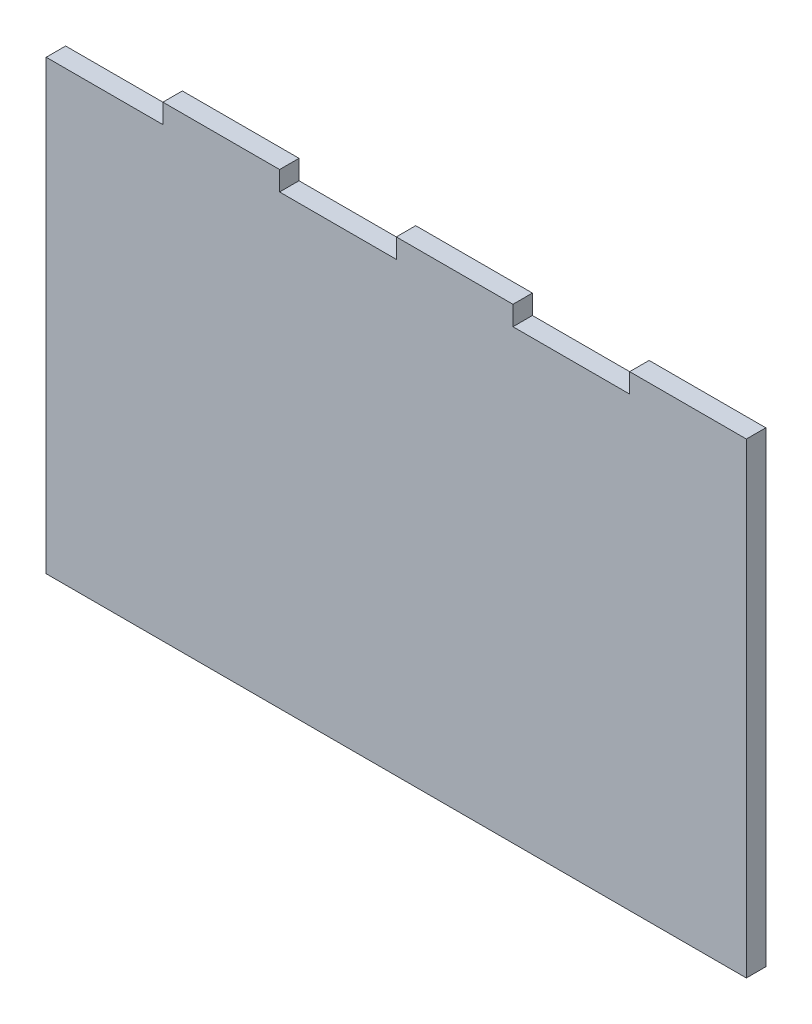
ISO-10303-21;
HEADER;
FILE_DESCRIPTION(('STEP AP214'),'2;1');
FILE_NAME('part.step','',(''),(''),'','','');
FILE_SCHEMA(('AUTOMOTIVE_DESIGN { 1 0 10303 214 1 1 1 1 }'));
ENDSEC;
DATA;
#1=APPLICATION_CONTEXT('core data for automotive mechanical design processes');
#2=APPLICATION_PROTOCOL_DEFINITION('international standard','automotive_design',2000,#1);
#3=PRODUCT_CONTEXT('',#1,'mechanical');
#4=PRODUCT('Part','Part','',(#3));
#5=PRODUCT_RELATED_PRODUCT_CATEGORY('part','',(#4));
#6=PRODUCT_DEFINITION_FORMATION('','',#4);
#7=PRODUCT_DEFINITION_CONTEXT('part definition',#1,'design');
#8=PRODUCT_DEFINITION('design','',#6,#7);
#9=PRODUCT_DEFINITION_SHAPE('','',#8);
#10=(LENGTH_UNIT() NAMED_UNIT(*) SI_UNIT(.MILLI.,.METRE.));
#11=(NAMED_UNIT(*) PLANE_ANGLE_UNIT() SI_UNIT($,.RADIAN.));
#12=(NAMED_UNIT(*) SI_UNIT($,.STERADIAN.) SOLID_ANGLE_UNIT());
#13=UNCERTAINTY_MEASURE_WITH_UNIT(LENGTH_MEASURE(1.E-05),#10,'distance_accuracy_value','');
#14=(GEOMETRIC_REPRESENTATION_CONTEXT(3) GLOBAL_UNCERTAINTY_ASSIGNED_CONTEXT((#13)) GLOBAL_UNIT_ASSIGNED_CONTEXT((#10,
#11,#12)) REPRESENTATION_CONTEXT('',''));
#15=CARTESIAN_POINT('',(0.,0.,0.));
#16=DIRECTION('',(0.,0.,1.));
#17=DIRECTION('',(1.,0.,0.));
#18=AXIS2_PLACEMENT_3D('',#15,#16,#17);
#19=CARTESIAN_POINT('',(228.6,152.4,12.7));
#20=DIRECTION('',(0.,-1.,0.));
#21=DIRECTION('',(1.,0.,0.));
#22=AXIS2_PLACEMENT_3D('',#19,#20,#21);
#23=PLANE('',#22);
#24=DIRECTION('',(0.,0.,1.));
#25=VECTOR('',#24,1.);
#26=CARTESIAN_POINT('',(76.2,152.4,0.));
#27=LINE('',#26,#25);
#28=CARTESIAN_POINT('',(76.2,152.4,0.));
#29=VERTEX_POINT('',#28);
#30=CARTESIAN_POINT('',(76.2,152.4,12.7));
#31=VERTEX_POINT('',#30);
#32=EDGE_CURVE('E164',#29,#31,#27,.T.);
#33=ORIENTED_EDGE('',*,*,#32,.F.);
#34=DIRECTION('',(-1.,0.,0.));
#35=VECTOR('',#34,1.);
#36=CARTESIAN_POINT('',(228.6,152.4,0.));
#37=LINE('',#36,#35);
#38=CARTESIAN_POINT('',(-1.11022302462516E-13,152.4,0.));
#39=VERTEX_POINT('',#38);
#40=EDGE_CURVE('E154',#29,#39,#37,.T.);
#41=ORIENTED_EDGE('',*,*,#40,.T.);
#42=DIRECTION('',(0.,0.,1.));
#43=VECTOR('',#42,1.);
#44=CARTESIAN_POINT('',(-1.11022302462516E-13,152.4,0.));
#45=LINE('',#44,#43);
#46=CARTESIAN_POINT('',(-1.11022302462516E-13,152.4,12.7));
#47=VERTEX_POINT('',#46);
#48=EDGE_CURVE('E189',#39,#47,#45,.T.);
#49=ORIENTED_EDGE('',*,*,#48,.T.);
#50=DIRECTION('',(-1.,0.,0.));
#51=VECTOR('',#50,1.);
#52=CARTESIAN_POINT('',(228.6,152.4,12.7));
#53=LINE('',#52,#51);
#54=EDGE_CURVE('E217',#31,#47,#53,.T.);
#55=ORIENTED_EDGE('',*,*,#54,.F.);
#56=EDGE_LOOP('',(#33,#41,#49,#55));
#57=FACE_BOUND('',#56,.T.);
#58=ADVANCED_FACE('F33',(#57),#23,.F.);
#59=DIRECTION('',(0.,0.,1.));
#60=VECTOR('',#59,1.);
#61=CARTESIAN_POINT('',(152.4,152.4,0.));
#62=LINE('',#61,#60);
#63=CARTESIAN_POINT('',(152.4,152.4,0.));
#64=VERTEX_POINT('',#63);
#65=CARTESIAN_POINT('',(152.4,152.4,12.7));
#66=VERTEX_POINT('',#65);
#67=EDGE_CURVE('E167',#64,#66,#62,.T.);
#68=ORIENTED_EDGE('',*,*,#67,.T.);
#69=CARTESIAN_POINT('',(228.6,152.4,12.7));
#70=VERTEX_POINT('',#69);
#71=EDGE_CURVE('E213',#70,#66,#53,.T.);
#72=ORIENTED_EDGE('',*,*,#71,.F.);
#73=DIRECTION('',(0.,0.,-1.));
#74=VECTOR('',#73,1.);
#75=CARTESIAN_POINT('',(228.6,152.4,12.7));
#76=LINE('',#75,#74);
#77=CARTESIAN_POINT('',(228.6,152.4,0.));
#78=VERTEX_POINT('',#77);
#79=EDGE_CURVE('E226',#70,#78,#76,.T.);
#80=ORIENTED_EDGE('',*,*,#79,.T.);
#81=EDGE_CURVE('E227',#78,#64,#37,.T.);
#82=ORIENTED_EDGE('',*,*,#81,.T.);
#83=EDGE_LOOP('',(#68,#72,#80,#82));
#84=FACE_BOUND('',#83,.T.);
#85=ADVANCED_FACE('F250',(#84),#23,.F.);
#86=CARTESIAN_POINT('',(0.,0.,12.7));
#87=DIRECTION('',(0.,0.,1.));
#88=DIRECTION('',(1.,0.,0.));
#89=AXIS2_PLACEMENT_3D('',#86,#87,#88);
#90=PLANE('',#89);
#91=DIRECTION('',(1.,0.,0.));
#92=VECTOR('',#91,1.);
#93=CARTESIAN_POINT('',(0.,139.7,12.7));
#94=LINE('',#93,#92);
#95=CARTESIAN_POINT('',(76.2,139.7,12.7));
#96=VERTEX_POINT('',#95);
#97=CARTESIAN_POINT('',(152.4,139.7,12.7));
#98=VERTEX_POINT('',#97);
#99=EDGE_CURVE('E158',#96,#98,#94,.T.);
#100=ORIENTED_EDGE('',*,*,#99,.F.);
#101=DIRECTION('',(0.,1.,0.));
#102=VECTOR('',#101,1.);
#103=CARTESIAN_POINT('',(76.1999999999998,0.,12.7));
#104=LINE('',#103,#102);
#105=EDGE_CURVE('E141',#96,#31,#104,.T.);
#106=ORIENTED_EDGE('',*,*,#105,.T.);
#107=ORIENTED_EDGE('',*,*,#54,.T.);
#108=DIRECTION('',(0.,-1.,0.));
#109=VECTOR('',#108,1.);
#110=CARTESIAN_POINT('',(-1.11022302462516E-13,0.,12.7));
#111=LINE('',#110,#109);
#112=CARTESIAN_POINT('',(-1.11022302462516E-13,139.7,12.7));
#113=VERTEX_POINT('',#112);
#114=EDGE_CURVE('E174',#47,#113,#111,.T.);
#115=ORIENTED_EDGE('',*,*,#114,.T.);
#116=DIRECTION('',(1.,0.,0.));
#117=VECTOR('',#116,1.);
#118=CARTESIAN_POINT('',(0.,139.7,12.7));
#119=LINE('',#118,#117);
#120=CARTESIAN_POINT('',(-76.2000000000001,139.7,12.7));
#121=VERTEX_POINT('',#120);
#122=EDGE_CURVE('E182',#121,#113,#119,.T.);
#123=ORIENTED_EDGE('',*,*,#122,.F.);
#124=DIRECTION('',(0.,1.,0.));
#125=VECTOR('',#124,1.);
#126=CARTESIAN_POINT('',(-76.2000000000001,0.,12.7));
#127=LINE('',#126,#125);
#128=CARTESIAN_POINT('',(-76.2000000000001,152.4,12.7));
#129=VERTEX_POINT('',#128);
#130=EDGE_CURVE('E166',#121,#129,#127,.T.);
#131=ORIENTED_EDGE('',*,*,#130,.T.);
#132=CARTESIAN_POINT('',(-152.4,152.4,12.7));
#133=VERTEX_POINT('',#132);
#134=EDGE_CURVE('E218',#129,#133,#53,.T.);
#135=ORIENTED_EDGE('',*,*,#134,.T.);
#136=DIRECTION('',(0.,-1.,0.));
#137=VECTOR('',#136,1.);
#138=CARTESIAN_POINT('',(-152.4,0.,12.7));
#139=LINE('',#138,#137);
#140=CARTESIAN_POINT('',(-152.4,139.7,12.7));
#141=VERTEX_POINT('',#140);
#142=EDGE_CURVE('E198',#133,#141,#139,.T.);
#143=ORIENTED_EDGE('',*,*,#142,.T.);
#144=DIRECTION('',(1.,0.,0.));
#145=VECTOR('',#144,1.);
#146=CARTESIAN_POINT('',(0.,139.7,12.7));
#147=LINE('',#146,#145);
#148=CARTESIAN_POINT('',(-228.6,139.7,12.7));
#149=VERTEX_POINT('',#148);
#150=EDGE_CURVE('E188',#149,#141,#147,.T.);
#151=ORIENTED_EDGE('',*,*,#150,.F.);
#152=DIRECTION('',(0.,-1.,0.));
#153=VECTOR('',#152,1.);
#154=CARTESIAN_POINT('',(-228.6,152.4,12.7));
#155=LINE('',#154,#153);
#156=CARTESIAN_POINT('',(-228.6,-152.4,12.7));
#157=VERTEX_POINT('',#156);
#158=EDGE_CURVE('E216',#149,#157,#155,.T.);
#159=ORIENTED_EDGE('',*,*,#158,.T.);
#160=DIRECTION('',(-1.,0.,0.));
#161=VECTOR('',#160,1.);
#162=CARTESIAN_POINT('',(228.6,-152.4,12.7));
#163=LINE('',#162,#161);
#164=CARTESIAN_POINT('',(228.6,-152.4,12.7));
#165=VERTEX_POINT('',#164);
#166=EDGE_CURVE('E220',#165,#157,#163,.T.);
#167=ORIENTED_EDGE('',*,*,#166,.F.);
#168=DIRECTION('',(0.,-1.,0.));
#169=VECTOR('',#168,1.);
#170=CARTESIAN_POINT('',(228.6,152.4,12.7));
#171=LINE('',#170,#169);
#172=EDGE_CURVE('E223',#70,#165,#171,.T.);
#173=ORIENTED_EDGE('',*,*,#172,.F.);
#174=ORIENTED_EDGE('',*,*,#71,.T.);
#175=DIRECTION('',(0.,-1.,0.));
#176=VECTOR('',#175,1.);
#177=CARTESIAN_POINT('',(152.4,0.,12.7));
#178=LINE('',#177,#176);
#179=EDGE_CURVE('E155',#66,#98,#178,.T.);
#180=ORIENTED_EDGE('',*,*,#179,.T.);
#181=EDGE_LOOP('',(#100,#106,#107,#115,#123,#131,#135,#143,#151,#159,#167,#173,#174,#180));
#182=FACE_BOUND('',#181,.T.);
#183=ADVANCED_FACE('F253',(#182),#90,.T.);
#184=CARTESIAN_POINT('',(0.,0.,0.));
#185=DIRECTION('',(0.,0.,1.));
#186=DIRECTION('',(1.,0.,0.));
#187=AXIS2_PLACEMENT_3D('',#184,#185,#186);
#188=PLANE('',#187);
#189=DIRECTION('',(0.,1.,0.));
#190=VECTOR('',#189,1.);
#191=CARTESIAN_POINT('',(76.1999999999998,0.,0.));
#192=LINE('',#191,#190);
#193=CARTESIAN_POINT('',(76.2,139.7,0.));
#194=VERTEX_POINT('',#193);
#195=EDGE_CURVE('E138',#194,#29,#192,.T.);
#196=ORIENTED_EDGE('',*,*,#195,.F.);
#197=DIRECTION('',(1.,0.,0.));
#198=VECTOR('',#197,1.);
#199=CARTESIAN_POINT('',(0.,139.7,0.));
#200=LINE('',#199,#198);
#201=CARTESIAN_POINT('',(152.4,139.7,0.));
#202=VERTEX_POINT('',#201);
#203=EDGE_CURVE('E146',#194,#202,#200,.T.);
#204=ORIENTED_EDGE('',*,*,#203,.T.);
#205=DIRECTION('',(0.,-1.,0.));
#206=VECTOR('',#205,1.);
#207=CARTESIAN_POINT('',(152.4,0.,0.));
#208=LINE('',#207,#206);
#209=EDGE_CURVE('E143',#64,#202,#208,.T.);
#210=ORIENTED_EDGE('',*,*,#209,.F.);
#211=ORIENTED_EDGE('',*,*,#81,.F.);
#212=DIRECTION('',(0.,-1.,0.));
#213=VECTOR('',#212,1.);
#214=CARTESIAN_POINT('',(228.6,152.4,0.));
#215=LINE('',#214,#213);
#216=CARTESIAN_POINT('',(228.6,-152.4,0.));
#217=VERTEX_POINT('',#216);
#218=EDGE_CURVE('E235',#78,#217,#215,.T.);
#219=ORIENTED_EDGE('',*,*,#218,.T.);
#220=DIRECTION('',(-1.,0.,0.));
#221=VECTOR('',#220,1.);
#222=CARTESIAN_POINT('',(228.6,-152.4,0.));
#223=LINE('',#222,#221);
#224=CARTESIAN_POINT('',(-228.6,-152.4,0.));
#225=VERTEX_POINT('',#224);
#226=EDGE_CURVE('E232',#217,#225,#223,.T.);
#227=ORIENTED_EDGE('',*,*,#226,.T.);
#228=DIRECTION('',(0.,-1.,0.));
#229=VECTOR('',#228,1.);
#230=CARTESIAN_POINT('',(-228.6,152.4,0.));
#231=LINE('',#230,#229);
#232=CARTESIAN_POINT('',(-228.6,139.7,0.));
#233=VERTEX_POINT('',#232);
#234=EDGE_CURVE('E230',#233,#225,#231,.T.);
#235=ORIENTED_EDGE('',*,*,#234,.F.);
#236=DIRECTION('',(1.,0.,0.));
#237=VECTOR('',#236,1.);
#238=CARTESIAN_POINT('',(0.,139.7,0.));
#239=LINE('',#238,#237);
#240=CARTESIAN_POINT('',(-152.4,139.7,0.));
#241=VERTEX_POINT('',#240);
#242=EDGE_CURVE('E194',#233,#241,#239,.T.);
#243=ORIENTED_EDGE('',*,*,#242,.T.);
#244=DIRECTION('',(0.,-1.,0.));
#245=VECTOR('',#244,1.);
#246=CARTESIAN_POINT('',(-152.4,0.,0.));
#247=LINE('',#246,#245);
#248=CARTESIAN_POINT('',(-152.4,152.4,0.));
#249=VERTEX_POINT('',#248);
#250=EDGE_CURVE('E197',#249,#241,#247,.T.);
#251=ORIENTED_EDGE('',*,*,#250,.F.);
#252=CARTESIAN_POINT('',(-76.2000000000001,152.4,0.));
#253=VERTEX_POINT('',#252);
#254=EDGE_CURVE('E209',#253,#249,#37,.T.);
#255=ORIENTED_EDGE('',*,*,#254,.F.);
#256=DIRECTION('',(0.,1.,0.));
#257=VECTOR('',#256,1.);
#258=CARTESIAN_POINT('',(-76.2000000000001,0.,0.));
#259=LINE('',#258,#257);
#260=CARTESIAN_POINT('',(-76.2000000000001,139.7,0.));
#261=VERTEX_POINT('',#260);
#262=EDGE_CURVE('E171',#261,#253,#259,.T.);
#263=ORIENTED_EDGE('',*,*,#262,.F.);
#264=DIRECTION('',(1.,0.,0.));
#265=VECTOR('',#264,1.);
#266=CARTESIAN_POINT('',(0.,139.7,0.));
#267=LINE('',#266,#265);
#268=CARTESIAN_POINT('',(-1.11022302462516E-13,139.7,0.));
#269=VERTEX_POINT('',#268);
#270=EDGE_CURVE('E173',#261,#269,#267,.T.);
#271=ORIENTED_EDGE('',*,*,#270,.T.);
#272=DIRECTION('',(0.,-1.,0.));
#273=VECTOR('',#272,1.);
#274=CARTESIAN_POINT('',(-1.11022302462516E-13,0.,0.));
#275=LINE('',#274,#273);
#276=EDGE_CURVE('E177',#39,#269,#275,.T.);
#277=ORIENTED_EDGE('',*,*,#276,.F.);
#278=ORIENTED_EDGE('',*,*,#40,.F.);
#279=EDGE_LOOP('',(#196,#204,#210,#211,#219,#227,#235,#243,#251,#255,#263,#271,#277,#278));
#280=FACE_BOUND('',#279,.T.);
#281=ADVANCED_FACE('F152',(#280),#188,.F.);
#282=DIRECTION('',(0.,0.,1.));
#283=VECTOR('',#282,1.);
#284=CARTESIAN_POINT('',(-76.2000000000001,152.4,0.));
#285=LINE('',#284,#283);
#286=EDGE_CURVE('E186',#253,#129,#285,.T.);
#287=ORIENTED_EDGE('',*,*,#286,.F.);
#288=ORIENTED_EDGE('',*,*,#254,.T.);
#289=DIRECTION('',(0.,0.,1.));
#290=VECTOR('',#289,1.);
#291=CARTESIAN_POINT('',(-152.4,152.4,0.));
#292=LINE('',#291,#290);
#293=EDGE_CURVE('E206',#249,#133,#292,.T.);
#294=ORIENTED_EDGE('',*,*,#293,.T.);
#295=ORIENTED_EDGE('',*,*,#134,.F.);
#296=EDGE_LOOP('',(#287,#288,#294,#295));
#297=FACE_BOUND('',#296,.T.);
#298=ADVANCED_FACE('F35',(#297),#23,.F.);
#299=CARTESIAN_POINT('',(-228.6,152.4,12.7));
#300=DIRECTION('',(1.,0.,0.));
#301=DIRECTION('',(0.,1.,0.));
#302=AXIS2_PLACEMENT_3D('',#299,#300,#301);
#303=PLANE('',#302);
#304=ORIENTED_EDGE('',*,*,#158,.F.);
#305=DIRECTION('',(0.,0.,1.));
#306=VECTOR('',#305,1.);
#307=CARTESIAN_POINT('',(-228.6,139.7,0.));
#308=LINE('',#307,#306);
#309=EDGE_CURVE('E201',#233,#149,#308,.T.);
#310=ORIENTED_EDGE('',*,*,#309,.F.);
#311=ORIENTED_EDGE('',*,*,#234,.T.);
#312=DIRECTION('',(0.,0.,-1.));
#313=VECTOR('',#312,1.);
#314=CARTESIAN_POINT('',(-228.6,-152.4,12.7));
#315=LINE('',#314,#313);
#316=EDGE_CURVE('E11',#157,#225,#315,.T.);
#317=ORIENTED_EDGE('',*,*,#316,.F.);
#318=EDGE_LOOP('',(#304,#310,#311,#317));
#319=FACE_BOUND('',#318,.T.);
#320=ADVANCED_FACE('F258',(#319),#303,.F.);
#321=CARTESIAN_POINT('',(228.6,-152.4,12.7));
#322=DIRECTION('',(0.,-1.,0.));
#323=DIRECTION('',(1.,0.,0.));
#324=AXIS2_PLACEMENT_3D('',#321,#322,#323);
#325=PLANE('',#324);
#326=ORIENTED_EDGE('',*,*,#226,.F.);
#327=DIRECTION('',(0.,0.,-1.));
#328=VECTOR('',#327,1.);
#329=CARTESIAN_POINT('',(228.6,-152.4,12.7));
#330=LINE('',#329,#328);
#331=EDGE_CURVE('E41',#165,#217,#330,.T.);
#332=ORIENTED_EDGE('',*,*,#331,.F.);
#333=ORIENTED_EDGE('',*,*,#166,.T.);
#334=ORIENTED_EDGE('',*,*,#316,.T.);
#335=EDGE_LOOP('',(#326,#332,#333,#334));
#336=FACE_BOUND('',#335,.T.);
#337=ADVANCED_FACE('F245',(#336),#325,.T.);
#338=CARTESIAN_POINT('',(228.6,152.4,12.7));
#339=DIRECTION('',(1.,0.,0.));
#340=DIRECTION('',(0.,1.,0.));
#341=AXIS2_PLACEMENT_3D('',#338,#339,#340);
#342=PLANE('',#341);
#343=ORIENTED_EDGE('',*,*,#218,.F.);
#344=ORIENTED_EDGE('',*,*,#79,.F.);
#345=ORIENTED_EDGE('',*,*,#172,.T.);
#346=ORIENTED_EDGE('',*,*,#331,.T.);
#347=EDGE_LOOP('',(#343,#344,#345,#346));
#348=FACE_BOUND('',#347,.T.);
#349=ADVANCED_FACE('F241',(#348),#342,.T.);
#350=CARTESIAN_POINT('',(-152.4,0.,0.));
#351=DIRECTION('',(-1.,0.,0.));
#352=DIRECTION('',(0.,0.,1.));
#353=AXIS2_PLACEMENT_3D('',#350,#351,#352);
#354=PLANE('',#353);
#355=ORIENTED_EDGE('',*,*,#142,.F.);
#356=ORIENTED_EDGE('',*,*,#293,.F.);
#357=ORIENTED_EDGE('',*,*,#250,.T.);
#358=DIRECTION('',(0.,0.,1.));
#359=VECTOR('',#358,1.);
#360=CARTESIAN_POINT('',(-152.4,139.7,0.));
#361=LINE('',#360,#359);
#362=EDGE_CURVE('E210',#241,#141,#361,.T.);
#363=ORIENTED_EDGE('',*,*,#362,.T.);
#364=EDGE_LOOP('',(#355,#356,#357,#363));
#365=FACE_BOUND('',#364,.T.);
#366=ADVANCED_FACE('F266',(#365),#354,.T.);
#367=CARTESIAN_POINT('',(0.,139.7,0.));
#368=DIRECTION('',(0.,-1.,0.));
#369=DIRECTION('',(0.,0.,-1.));
#370=AXIS2_PLACEMENT_3D('',#367,#368,#369);
#371=PLANE('',#370);
#372=ORIENTED_EDGE('',*,*,#150,.T.);
#373=ORIENTED_EDGE('',*,*,#362,.F.);
#374=ORIENTED_EDGE('',*,*,#242,.F.);
#375=ORIENTED_EDGE('',*,*,#309,.T.);
#376=EDGE_LOOP('',(#372,#373,#374,#375));
#377=FACE_BOUND('',#376,.T.);
#378=ADVANCED_FACE('F262',(#377),#371,.F.);
#379=CARTESIAN_POINT('',(-76.2000000000001,0.,0.));
#380=DIRECTION('',(1.,0.,0.));
#381=DIRECTION('',(0.,0.,-1.));
#382=AXIS2_PLACEMENT_3D('',#379,#380,#381);
#383=PLANE('',#382);
#384=ORIENTED_EDGE('',*,*,#130,.F.);
#385=DIRECTION('',(0.,0.,1.));
#386=VECTOR('',#385,1.);
#387=CARTESIAN_POINT('',(-76.2000000000001,139.7,0.));
#388=LINE('',#387,#386);
#389=EDGE_CURVE('E179',#261,#121,#388,.T.);
#390=ORIENTED_EDGE('',*,*,#389,.F.);
#391=ORIENTED_EDGE('',*,*,#262,.T.);
#392=ORIENTED_EDGE('',*,*,#286,.T.);
#393=EDGE_LOOP('',(#384,#390,#391,#392));
#394=FACE_BOUND('',#393,.T.);
#395=ADVANCED_FACE('F281',(#394),#383,.T.);
#396=CARTESIAN_POINT('',(-1.11022302462516E-13,0.,0.));
#397=DIRECTION('',(-1.,0.,0.));
#398=DIRECTION('',(0.,0.,1.));
#399=AXIS2_PLACEMENT_3D('',#396,#397,#398);
#400=PLANE('',#399);
#401=ORIENTED_EDGE('',*,*,#114,.F.);
#402=ORIENTED_EDGE('',*,*,#48,.F.);
#403=ORIENTED_EDGE('',*,*,#276,.T.);
#404=DIRECTION('',(0.,0.,1.));
#405=VECTOR('',#404,1.);
#406=CARTESIAN_POINT('',(-1.11022302462516E-13,139.7,0.));
#407=LINE('',#406,#405);
#408=EDGE_CURVE('E56',#269,#113,#407,.T.);
#409=ORIENTED_EDGE('',*,*,#408,.T.);
#410=EDGE_LOOP('',(#401,#402,#403,#409));
#411=FACE_BOUND('',#410,.T.);
#412=ADVANCED_FACE('F276',(#411),#400,.T.);
#413=CARTESIAN_POINT('',(0.,139.7,0.));
#414=DIRECTION('',(0.,-1.,0.));
#415=DIRECTION('',(0.,0.,-1.));
#416=AXIS2_PLACEMENT_3D('',#413,#414,#415);
#417=PLANE('',#416);
#418=ORIENTED_EDGE('',*,*,#122,.T.);
#419=ORIENTED_EDGE('',*,*,#408,.F.);
#420=ORIENTED_EDGE('',*,*,#270,.F.);
#421=ORIENTED_EDGE('',*,*,#389,.T.);
#422=EDGE_LOOP('',(#418,#419,#420,#421));
#423=FACE_BOUND('',#422,.T.);
#424=ADVANCED_FACE('F277',(#423),#417,.F.);
#425=CARTESIAN_POINT('',(76.1999999999998,0.,0.));
#426=DIRECTION('',(1.,0.,0.));
#427=DIRECTION('',(0.,1.,0.));
#428=AXIS2_PLACEMENT_3D('',#425,#426,#427);
#429=PLANE('',#428);
#430=ORIENTED_EDGE('',*,*,#105,.F.);
#431=DIRECTION('',(0.,0.,1.));
#432=VECTOR('',#431,1.);
#433=CARTESIAN_POINT('',(76.2,139.7,0.));
#434=LINE('',#433,#432);
#435=EDGE_CURVE('E135',#194,#96,#434,.T.);
#436=ORIENTED_EDGE('',*,*,#435,.F.);
#437=ORIENTED_EDGE('',*,*,#195,.T.);
#438=ORIENTED_EDGE('',*,*,#32,.T.);
#439=EDGE_LOOP('',(#430,#436,#437,#438));
#440=FACE_BOUND('',#439,.T.);
#441=ADVANCED_FACE('F136',(#440),#429,.T.);
#442=CARTESIAN_POINT('',(152.4,0.,0.));
#443=DIRECTION('',(-1.,0.,0.));
#444=DIRECTION('',(0.,0.,1.));
#445=AXIS2_PLACEMENT_3D('',#442,#443,#444);
#446=PLANE('',#445);
#447=ORIENTED_EDGE('',*,*,#179,.F.);
#448=ORIENTED_EDGE('',*,*,#67,.F.);
#449=ORIENTED_EDGE('',*,*,#209,.T.);
#450=DIRECTION('',(0.,0.,1.));
#451=VECTOR('',#450,1.);
#452=CARTESIAN_POINT('',(152.4,139.7,0.));
#453=LINE('',#452,#451);
#454=EDGE_CURVE('E48',#202,#98,#453,.T.);
#455=ORIENTED_EDGE('',*,*,#454,.T.);
#456=EDGE_LOOP('',(#447,#448,#449,#455));
#457=FACE_BOUND('',#456,.T.);
#458=ADVANCED_FACE('F283',(#457),#446,.T.);
#459=CARTESIAN_POINT('',(0.,139.7,0.));
#460=DIRECTION('',(0.,-1.,0.));
#461=DIRECTION('',(0.,0.,-1.));
#462=AXIS2_PLACEMENT_3D('',#459,#460,#461);
#463=PLANE('',#462);
#464=ORIENTED_EDGE('',*,*,#99,.T.);
#465=ORIENTED_EDGE('',*,*,#454,.F.);
#466=ORIENTED_EDGE('',*,*,#203,.F.);
#467=ORIENTED_EDGE('',*,*,#435,.T.);
#468=EDGE_LOOP('',(#464,#465,#466,#467));
#469=FACE_BOUND('',#468,.T.);
#470=ADVANCED_FACE('F147',(#469),#463,.F.);
#471=CLOSED_SHELL('',(#58,#85,#183,#281,#298,#320,#337,#349,#366,#378,#395,#412,#424,#441,#458,#470));
#472=MANIFOLD_SOLID_BREP('B2',#471);
#473=ADVANCED_BREP_SHAPE_REPRESENTATION('',(#18,#472),#14);
#474=SHAPE_DEFINITION_REPRESENTATION(#9,#473);
ENDSEC;
END-ISO-10303-21;
